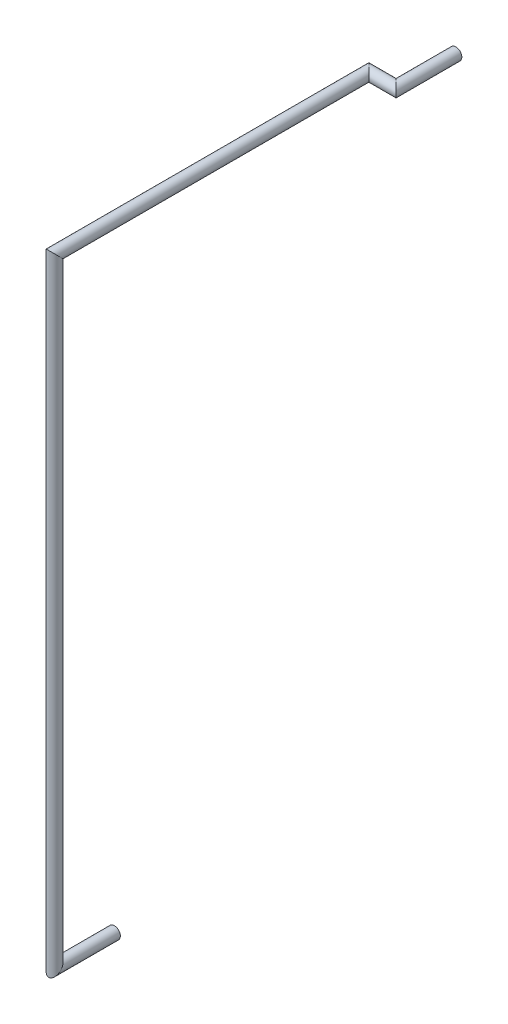
ISO-10303-21;
HEADER;
FILE_DESCRIPTION(('STEP AP214'),'2;1');
FILE_NAME('part.step','',(''),(''),'','','');
FILE_SCHEMA(('AUTOMOTIVE_DESIGN { 1 0 10303 214 1 1 1 1 }'));
ENDSEC;
DATA;
#1=APPLICATION_CONTEXT('core data for automotive mechanical design processes');
#2=APPLICATION_PROTOCOL_DEFINITION('international standard','automotive_design',2000,#1);
#3=PRODUCT_CONTEXT('',#1,'mechanical');
#4=PRODUCT('Part','Part','',(#3));
#5=PRODUCT_RELATED_PRODUCT_CATEGORY('part','',(#4));
#6=PRODUCT_DEFINITION_FORMATION('','',#4);
#7=PRODUCT_DEFINITION_CONTEXT('part definition',#1,'design');
#8=PRODUCT_DEFINITION('design','',#6,#7);
#9=PRODUCT_DEFINITION_SHAPE('','',#8);
#10=(LENGTH_UNIT() NAMED_UNIT(*) SI_UNIT(.MILLI.,.METRE.));
#11=(NAMED_UNIT(*) PLANE_ANGLE_UNIT() SI_UNIT($,.RADIAN.));
#12=(NAMED_UNIT(*) SI_UNIT($,.STERADIAN.) SOLID_ANGLE_UNIT());
#13=UNCERTAINTY_MEASURE_WITH_UNIT(LENGTH_MEASURE(1.E-05),#10,'distance_accuracy_value','');
#14=(GEOMETRIC_REPRESENTATION_CONTEXT(3) GLOBAL_UNCERTAINTY_ASSIGNED_CONTEXT((#13)) GLOBAL_UNIT_ASSIGNED_CONTEXT((#10,
#11,#12)) REPRESENTATION_CONTEXT('',''));
#15=CARTESIAN_POINT('',(0.,0.,0.));
#16=DIRECTION('',(0.,0.,1.));
#17=DIRECTION('',(1.,0.,0.));
#18=AXIS2_PLACEMENT_3D('',#15,#16,#17);
#19=CARTESIAN_POINT('',(2.28,51.68,-26.2899999999998));
#20=DIRECTION('',(0.,0.,-1.));
#21=DIRECTION('',(1.,0.,0.));
#22=AXIS2_PLACEMENT_3D('',#19,#20,#21);
#23=PLANE('',#22);
#24=CARTESIAN_POINT('',(2.28,51.68,-26.2899999999998));
#25=DIRECTION('',(0.,0.,-1.));
#26=DIRECTION('',(1.,0.,0.));
#27=AXIS2_PLACEMENT_3D('',#24,#25,#26);
#28=CIRCLE('',#27,0.5);
#29=CARTESIAN_POINT('',(2.78,51.68,-26.2899999999998));
#30=VERTEX_POINT('',#29);
#31=EDGE_CURVE('E44',#30,#30,#28,.T.);
#32=ORIENTED_EDGE('',*,*,#31,.T.);
#33=EDGE_LOOP('',(#32));
#34=FACE_BOUND('',#33,.T.);
#35=ADVANCED_FACE('F41',(#34),#23,.T.);
#36=CARTESIAN_POINT('',(0.,0.,0.));
#37=DIRECTION('',(0.,0.,1.));
#38=DIRECTION('',(1.,0.,0.));
#39=AXIS2_PLACEMENT_3D('',#36,#37,#38);
#40=PLANE('',#39);
#41=CARTESIAN_POINT('',(0.,0.,0.));
#42=DIRECTION('',(0.,0.,1.));
#43=DIRECTION('',(1.,0.,0.));
#44=AXIS2_PLACEMENT_3D('',#41,#42,#43);
#45=CIRCLE('',#44,0.5);
#46=CARTESIAN_POINT('',(0.5,0.,0.));
#47=VERTEX_POINT('',#46);
#48=EDGE_CURVE('E48',#47,#47,#45,.T.);
#49=ORIENTED_EDGE('',*,*,#48,.F.);
#50=EDGE_LOOP('',(#49));
#51=FACE_BOUND('',#50,.T.);
#52=ADVANCED_FACE('F71',(#51),#40,.F.);
#53=CARTESIAN_POINT('',(2.28,51.68,-20.64));
#54=DIRECTION('',(0.,0.,-1.));
#55=DIRECTION('',(-1.,0.,0.));
#56=AXIS2_PLACEMENT_3D('',#53,#54,#55);
#57=CYLINDRICAL_SURFACE('',#56,0.5);
#58=CARTESIAN_POINT('',(2.28,51.68,-21.29));
#59=DIRECTION('',(0.707106781186548,0.,-0.707106781186548));
#60=DIRECTION('',(0.707106781186548,0.,0.707106781186548));
#61=AXIS2_PLACEMENT_3D('',#58,#59,#60);
#62=ELLIPSE('',#61,0.707106781186547,0.5);
#63=CARTESIAN_POINT('',(2.78,51.68,-20.79));
#64=VERTEX_POINT('',#63);
#65=EDGE_CURVE('E60',#64,#64,#62,.F.);
#66=ORIENTED_EDGE('',*,*,#65,.F.);
#67=EDGE_LOOP('',(#66));
#68=FACE_BOUND('',#67,.T.);
#69=ORIENTED_EDGE('',*,*,#31,.F.);
#70=EDGE_LOOP('',(#69));
#71=FACE_BOUND('',#70,.T.);
#72=ADVANCED_FACE('F68',(#68,#71),#57,.T.);
#73=CARTESIAN_POINT('',(-0.649999999999989,51.68,-21.29));
#74=DIRECTION('',(1.,0.,0.));
#75=DIRECTION('',(0.,1.,0.));
#76=AXIS2_PLACEMENT_3D('',#73,#74,#75);
#77=CYLINDRICAL_SURFACE('',#76,0.5);
#78=CARTESIAN_POINT('',(0.,51.68,-21.29));
#79=DIRECTION('',(0.707106781186547,0.,-0.707106781186547));
#80=DIRECTION('',(-0.707106781186548,0.,-0.707106781186548));
#81=AXIS2_PLACEMENT_3D('',#78,#79,#80);
#82=ELLIPSE('',#81,0.707106781186547,0.5);
#83=CARTESIAN_POINT('',(-0.5,51.68,-21.79));
#84=VERTEX_POINT('',#83);
#85=EDGE_CURVE('E58',#84,#84,#82,.F.);
#86=ORIENTED_EDGE('',*,*,#85,.F.);
#87=EDGE_LOOP('',(#86));
#88=FACE_BOUND('',#87,.T.);
#89=ORIENTED_EDGE('',*,*,#65,.T.);
#90=EDGE_LOOP('',(#89));
#91=FACE_BOUND('',#90,.T.);
#92=ADVANCED_FACE('F70',(#88,#91),#77,.T.);
#93=CARTESIAN_POINT('',(0.,51.68,6.2));
#94=DIRECTION('',(0.,0.,-1.));
#95=DIRECTION('',(0.,1.,0.));
#96=AXIS2_PLACEMENT_3D('',#93,#94,#95);
#97=CYLINDRICAL_SURFACE('',#96,0.5);
#98=CARTESIAN_POINT('',(0.,51.68,5.));
#99=DIRECTION('',(0.,0.707106781186548,-0.707106781186547));
#100=DIRECTION('',(0.,0.707106781186547,0.707106781186548));
#101=AXIS2_PLACEMENT_3D('',#98,#99,#100);
#102=ELLIPSE('',#101,0.707106781186547,0.5);
#103=CARTESIAN_POINT('',(0.,52.18,5.5));
#104=VERTEX_POINT('',#103);
#105=EDGE_CURVE('E53',#104,#104,#102,.F.);
#106=ORIENTED_EDGE('',*,*,#105,.F.);
#107=EDGE_LOOP('',(#106));
#108=FACE_BOUND('',#107,.T.);
#109=ORIENTED_EDGE('',*,*,#85,.T.);
#110=EDGE_LOOP('',(#109));
#111=FACE_BOUND('',#110,.T.);
#112=ADVANCED_FACE('F78',(#108,#111),#97,.T.);
#113=CARTESIAN_POINT('',(0.,-1.2,5.));
#114=DIRECTION('',(0.,1.,0.));
#115=DIRECTION('',(0.,0.,1.));
#116=AXIS2_PLACEMENT_3D('',#113,#114,#115);
#117=CYLINDRICAL_SURFACE('',#116,0.5);
#118=CARTESIAN_POINT('',(0.,0.,5.));
#119=DIRECTION('',(0.,0.707106781186547,0.707106781186547));
#120=DIRECTION('',(0.,-0.707106781186548,0.707106781186548));
#121=AXIS2_PLACEMENT_3D('',#118,#119,#120);
#122=ELLIPSE('',#121,0.707106781186547,0.5);
#123=CARTESIAN_POINT('',(0.,-0.5,5.5));
#124=VERTEX_POINT('',#123);
#125=EDGE_CURVE('E10',#124,#124,#122,.F.);
#126=ORIENTED_EDGE('',*,*,#125,.F.);
#127=EDGE_LOOP('',(#126));
#128=FACE_BOUND('',#127,.T.);
#129=ORIENTED_EDGE('',*,*,#105,.T.);
#130=EDGE_LOOP('',(#129));
#131=FACE_BOUND('',#130,.T.);
#132=ADVANCED_FACE('F84',(#128,#131),#117,.T.);
#133=CARTESIAN_POINT('',(0.,0.,0.));
#134=DIRECTION('',(0.,0.,1.));
#135=DIRECTION('',(1.,0.,0.));
#136=AXIS2_PLACEMENT_3D('',#133,#134,#135);
#137=CYLINDRICAL_SURFACE('',#136,0.5);
#138=ORIENTED_EDGE('',*,*,#48,.T.);
#139=EDGE_LOOP('',(#138));
#140=FACE_BOUND('',#139,.T.);
#141=ORIENTED_EDGE('',*,*,#125,.T.);
#142=EDGE_LOOP('',(#141));
#143=FACE_BOUND('',#142,.T.);
#144=ADVANCED_FACE('F82',(#140,#143),#137,.T.);
#145=CLOSED_SHELL('',(#35,#52,#72,#92,#112,#132,#144));
#146=MANIFOLD_SOLID_BREP('B2',#145);
#147=ADVANCED_BREP_SHAPE_REPRESENTATION('',(#18,#146),#14);
#148=SHAPE_DEFINITION_REPRESENTATION(#9,#147);
ENDSEC;
END-ISO-10303-21;
